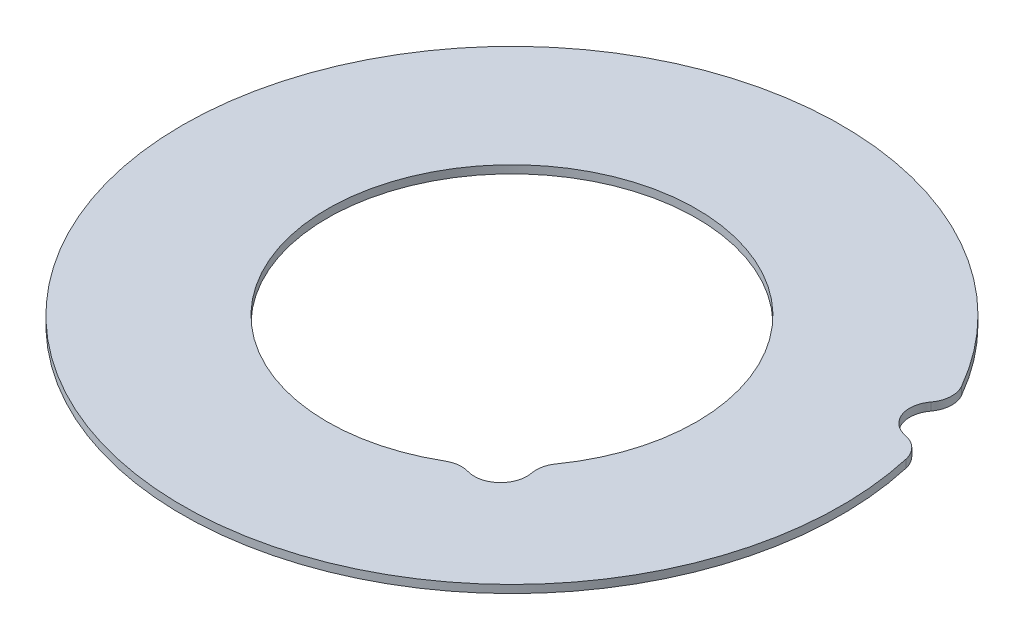
ISO-10303-21;
HEADER;
FILE_DESCRIPTION(('STEP AP214'),'2;1');
FILE_NAME('part.step','',(''),(''),'','','');
FILE_SCHEMA(('AUTOMOTIVE_DESIGN { 1 0 10303 214 1 1 1 1 }'));
ENDSEC;
DATA;
#1=APPLICATION_CONTEXT('core data for automotive mechanical design processes');
#2=APPLICATION_PROTOCOL_DEFINITION('international standard','automotive_design',2000,#1);
#3=PRODUCT_CONTEXT('',#1,'mechanical');
#4=PRODUCT('Part','Part','',(#3));
#5=PRODUCT_RELATED_PRODUCT_CATEGORY('part','',(#4));
#6=PRODUCT_DEFINITION_FORMATION('','',#4);
#7=PRODUCT_DEFINITION_CONTEXT('part definition',#1,'design');
#8=PRODUCT_DEFINITION('design','',#6,#7);
#9=PRODUCT_DEFINITION_SHAPE('','',#8);
#10=(LENGTH_UNIT() NAMED_UNIT(*) SI_UNIT(.MILLI.,.METRE.));
#11=(NAMED_UNIT(*) PLANE_ANGLE_UNIT() SI_UNIT($,.RADIAN.));
#12=(NAMED_UNIT(*) SI_UNIT($,.STERADIAN.) SOLID_ANGLE_UNIT());
#13=UNCERTAINTY_MEASURE_WITH_UNIT(LENGTH_MEASURE(1.E-05),#10,'distance_accuracy_value','');
#14=(GEOMETRIC_REPRESENTATION_CONTEXT(3) GLOBAL_UNCERTAINTY_ASSIGNED_CONTEXT((#13)) GLOBAL_UNIT_ASSIGNED_CONTEXT((#10,
#11,#12)) REPRESENTATION_CONTEXT('',''));
#15=CARTESIAN_POINT('',(0.,0.,0.));
#16=DIRECTION('',(0.,0.,1.));
#17=DIRECTION('',(1.,0.,0.));
#18=AXIS2_PLACEMENT_3D('',#15,#16,#17);
#19=CARTESIAN_POINT('',(-7.,0.,0.));
#20=DIRECTION('',(0.,1.,0.));
#21=DIRECTION('',(0.,0.,1.));
#22=AXIS2_PLACEMENT_3D('',#19,#20,#21);
#23=PLANE('',#22);
#24=CARTESIAN_POINT('',(4.5710736778126,0.,5.00000000005045));
#25=DIRECTION('',(0.,1.,0.));
#26=DIRECTION('',(0.,0.,1.));
#27=AXIS2_PLACEMENT_3D('',#24,#25,#26);
#28=CIRCLE('',#27,1.);
#29=CARTESIAN_POINT('',(4.29210611743141,0.,5.96030052606039));
#30=VERTEX_POINT('',#29);
#31=CARTESIAN_POINT('',(5.55247832229152,0.,4.80804968409548));
#32=VERTEX_POINT('',#31);
#33=EDGE_CURVE('E169',#30,#32,#28,.T.);
#34=ORIENTED_EDGE('',*,*,#33,.T.);
#35=CARTESIAN_POINT('',(6.53388296677043,0.,4.61609936814051));
#36=DIRECTION('',(0.,1.,0.));
#37=DIRECTION('',(0.,0.,1.));
#38=AXIS2_PLACEMENT_3D('',#35,#36,#37);
#39=CIRCLE('',#38,1.);
#40=CARTESIAN_POINT('',(5.71714759592413,0.,4.03908694712294));
#41=VERTEX_POINT('',#40);
#42=EDGE_CURVE('E144',#32,#41,#39,.F.);
#43=ORIENTED_EDGE('',*,*,#42,.T.);
#44=CARTESIAN_POINT('',(0.,0.,0.));
#45=DIRECTION('',(0.,-1.,0.));
#46=DIRECTION('',(0.,0.,-1.));
#47=AXIS2_PLACEMENT_3D('',#44,#45,#46);
#48=CIRCLE('',#47,7.);
#49=CARTESIAN_POINT('',(3.51149623741894,0.,6.05552592056154));
#50=VERTEX_POINT('',#49);
#51=EDGE_CURVE('E120',#50,#41,#48,.T.);
#52=ORIENTED_EDGE('',*,*,#51,.F.);
#53=CARTESIAN_POINT('',(4.01313855705022,0.,6.92060105207033));
#54=DIRECTION('',(0.,1.,0.));
#55=DIRECTION('',(0.,0.,1.));
#56=AXIS2_PLACEMENT_3D('',#53,#54,#55);
#57=CIRCLE('',#56,1.);
#58=EDGE_CURVE('E123',#50,#30,#57,.F.);
#59=ORIENTED_EDGE('',*,*,#58,.T.);
#60=EDGE_LOOP('',(#34,#43,#52,#59));
#61=FACE_BOUND('',#60,.T.);
#62=CARTESIAN_POINT('',(11.5891883068672,0.,-4.50000000009671));
#63=DIRECTION('',(0.,1.,0.));
#64=DIRECTION('',(0.,0.,1.));
#65=AXIS2_PLACEMENT_3D('',#62,#63,#64);
#66=CIRCLE('',#65,1.);
#67=CARTESIAN_POINT('',(10.7888489190033,0.,-5.09954721611355));
#68=VERTEX_POINT('',#67);
#69=CARTESIAN_POINT('',(11.4031642291589,0.,-3.51745481410639));
#70=VERTEX_POINT('',#69);
#71=EDGE_CURVE('E153',#68,#70,#66,.T.);
#72=ORIENTED_EDGE('',*,*,#71,.T.);
#73=CARTESIAN_POINT('',(11.2171401514506,0.,-2.53490962811606));
#74=DIRECTION('',(0.,1.,0.));
#75=DIRECTION('',(0.,0.,1.));
#76=AXIS2_PLACEMENT_3D('',#73,#74,#75);
#77=CIRCLE('',#76,1.);
#78=CARTESIAN_POINT('',(12.1925436428811,0.,-2.75533655230006));
#79=VERTEX_POINT('',#78);
#80=EDGE_CURVE('E141',#70,#79,#77,.F.);
#81=ORIENTED_EDGE('',*,*,#80,.T.);
#82=CARTESIAN_POINT('',(0.,0.,0.));
#83=DIRECTION('',(0.,-1.,0.));
#84=DIRECTION('',(0.,0.,-1.));
#85=AXIS2_PLACEMENT_3D('',#82,#83,#84);
#86=CIRCLE('',#85,12.5);
#87=CARTESIAN_POINT('',(10.8570755773253,0.,-6.19466786101128));
#88=VERTEX_POINT('',#87);
#89=EDGE_CURVE('E129',#79,#88,#86,.T.);
#90=ORIENTED_EDGE('',*,*,#89,.T.);
#91=CARTESIAN_POINT('',(9.98850953113929,0.,-5.69909443213038));
#92=DIRECTION('',(0.,1.,0.));
#93=DIRECTION('',(0.,0.,1.));
#94=AXIS2_PLACEMENT_3D('',#91,#92,#93);
#95=CIRCLE('',#94,1.);
#96=EDGE_CURVE('E53',#88,#68,#95,.F.);
#97=ORIENTED_EDGE('',*,*,#96,.T.);
#98=EDGE_LOOP('',(#72,#81,#90,#97));
#99=FACE_BOUND('',#98,.T.);
#100=ADVANCED_FACE('F33',(#61,#99),#23,.F.);
#101=CARTESIAN_POINT('',(0.,0.,0.));
#102=DIRECTION('',(0.,-1.,0.));
#103=DIRECTION('',(0.,0.,-1.));
#104=AXIS2_PLACEMENT_3D('',#101,#102,#103);
#105=CYLINDRICAL_SURFACE('',#104,12.5);
#106=ORIENTED_EDGE('',*,*,#89,.F.);
#107=DIRECTION('',(0.,-1.,0.));
#108=VECTOR('',#107,1.);
#109=CARTESIAN_POINT('',(12.1925436428811,0.,-2.75533655230006));
#110=LINE('',#109,#108);
#111=CARTESIAN_POINT('',(12.1925436428811,0.299999999999999,-2.75533655230006));
#112=VERTEX_POINT('',#111);
#113=EDGE_CURVE('E149',#79,#112,#110,.F.);
#114=ORIENTED_EDGE('',*,*,#113,.T.);
#115=CARTESIAN_POINT('',(0.,0.299999999999999,0.));
#116=DIRECTION('',(0.,-1.,0.));
#117=DIRECTION('',(0.,0.,-1.));
#118=AXIS2_PLACEMENT_3D('',#115,#116,#117);
#119=CIRCLE('',#118,12.5);
#120=CARTESIAN_POINT('',(10.8570755773253,0.299999999999999,-6.19466786101128));
#121=VERTEX_POINT('',#120);
#122=EDGE_CURVE('E119',#112,#121,#119,.T.);
#123=ORIENTED_EDGE('',*,*,#122,.T.);
#124=DIRECTION('',(0.,-1.,0.));
#125=VECTOR('',#124,1.);
#126=CARTESIAN_POINT('',(10.8570755773253,0.,-6.19466786101128));
#127=LINE('',#126,#125);
#128=EDGE_CURVE('E146',#121,#88,#127,.T.);
#129=ORIENTED_EDGE('',*,*,#128,.T.);
#130=EDGE_LOOP('',(#106,#114,#123,#129));
#131=FACE_BOUND('',#130,.T.);
#132=ADVANCED_FACE('F162',(#131),#105,.T.);
#133=CARTESIAN_POINT('',(-12.5,0.299999999999999,0.));
#134=DIRECTION('',(0.,-1.,0.));
#135=DIRECTION('',(0.,0.,-1.));
#136=AXIS2_PLACEMENT_3D('',#133,#134,#135);
#137=PLANE('',#136);
#138=ORIENTED_EDGE('',*,*,#122,.F.);
#139=CARTESIAN_POINT('',(11.2171401514506,0.3,-2.53490962811606));
#140=DIRECTION('',(0.,-1.,0.));
#141=DIRECTION('',(0.,0.,-1.));
#142=AXIS2_PLACEMENT_3D('',#139,#140,#141);
#143=CIRCLE('',#142,1.);
#144=CARTESIAN_POINT('',(11.4031642291589,0.3,-3.51745481410639));
#145=VERTEX_POINT('',#144);
#146=EDGE_CURVE('E108',#112,#145,#143,.F.);
#147=ORIENTED_EDGE('',*,*,#146,.T.);
#148=CARTESIAN_POINT('',(11.5891883068672,0.3,-4.50000000009671));
#149=DIRECTION('',(0.,-1.,0.));
#150=DIRECTION('',(0.,0.,-1.));
#151=AXIS2_PLACEMENT_3D('',#148,#149,#150);
#152=CIRCLE('',#151,1.);
#153=CARTESIAN_POINT('',(10.7888489190033,0.3,-5.09954721611355));
#154=VERTEX_POINT('',#153);
#155=EDGE_CURVE('E124',#145,#154,#152,.T.);
#156=ORIENTED_EDGE('',*,*,#155,.T.);
#157=CARTESIAN_POINT('',(9.98850953113929,0.3,-5.69909443213038));
#158=DIRECTION('',(0.,-1.,0.));
#159=DIRECTION('',(0.,0.,-1.));
#160=AXIS2_PLACEMENT_3D('',#157,#158,#159);
#161=CIRCLE('',#160,1.);
#162=EDGE_CURVE('E126',#154,#121,#161,.F.);
#163=ORIENTED_EDGE('',*,*,#162,.T.);
#164=EDGE_LOOP('',(#138,#147,#156,#163));
#165=FACE_BOUND('',#164,.T.);
#166=CARTESIAN_POINT('',(0.,0.299999999999999,0.));
#167=DIRECTION('',(0.,-1.,0.));
#168=DIRECTION('',(0.,0.,-1.));
#169=AXIS2_PLACEMENT_3D('',#166,#167,#168);
#170=CIRCLE('',#169,7.);
#171=CARTESIAN_POINT('',(3.51149623741894,0.299999999999999,6.05552592056154));
#172=VERTEX_POINT('',#171);
#173=CARTESIAN_POINT('',(5.71714759592413,0.299999999999999,4.03908694712294));
#174=VERTEX_POINT('',#173);
#175=EDGE_CURVE('E101',#172,#174,#170,.T.);
#176=ORIENTED_EDGE('',*,*,#175,.T.);
#177=CARTESIAN_POINT('',(6.53388296677043,0.3,4.61609936814051));
#178=DIRECTION('',(0.,-1.,0.));
#179=DIRECTION('',(0.,0.,-1.));
#180=AXIS2_PLACEMENT_3D('',#177,#178,#179);
#181=CIRCLE('',#180,1.);
#182=CARTESIAN_POINT('',(5.55247832229152,0.299999999999999,4.80804968409548));
#183=VERTEX_POINT('',#182);
#184=EDGE_CURVE('E107',#174,#183,#181,.F.);
#185=ORIENTED_EDGE('',*,*,#184,.T.);
#186=CARTESIAN_POINT('',(4.5710736778126,0.299999999999999,5.00000000005045));
#187=DIRECTION('',(0.,1.,0.));
#188=DIRECTION('',(0.,0.,1.));
#189=AXIS2_PLACEMENT_3D('',#186,#187,#188);
#190=CIRCLE('',#189,1.);
#191=CARTESIAN_POINT('',(4.29210611743141,0.299999999999999,5.96030052606039));
#192=VERTEX_POINT('',#191);
#193=EDGE_CURVE('E103',#192,#183,#190,.T.);
#194=ORIENTED_EDGE('',*,*,#193,.F.);
#195=CARTESIAN_POINT('',(4.01313855705022,0.3,6.92060105207033));
#196=DIRECTION('',(0.,-1.,0.));
#197=DIRECTION('',(0.,0.,-1.));
#198=AXIS2_PLACEMENT_3D('',#195,#196,#197);
#199=CIRCLE('',#198,1.);
#200=EDGE_CURVE('E98',#192,#172,#199,.F.);
#201=ORIENTED_EDGE('',*,*,#200,.T.);
#202=EDGE_LOOP('',(#176,#185,#194,#201));
#203=FACE_BOUND('',#202,.T.);
#204=ADVANCED_FACE('F100',(#165,#203),#137,.F.);
#205=CARTESIAN_POINT('',(0.,0.,0.));
#206=DIRECTION('',(0.,-1.,0.));
#207=DIRECTION('',(0.,0.,-1.));
#208=AXIS2_PLACEMENT_3D('',#205,#206,#207);
#209=CYLINDRICAL_SURFACE('',#208,7.);
#210=ORIENTED_EDGE('',*,*,#51,.T.);
#211=DIRECTION('',(0.,-1.,0.));
#212=VECTOR('',#211,1.);
#213=CARTESIAN_POINT('',(5.71714759592413,0.,4.03908694712294));
#214=LINE('',#213,#212);
#215=EDGE_CURVE('E118',#41,#174,#214,.F.);
#216=ORIENTED_EDGE('',*,*,#215,.T.);
#217=ORIENTED_EDGE('',*,*,#175,.F.);
#218=DIRECTION('',(0.,-1.,0.));
#219=VECTOR('',#218,1.);
#220=CARTESIAN_POINT('',(3.51149623741894,0.,6.05552592056154));
#221=LINE('',#220,#219);
#222=EDGE_CURVE('E115',#172,#50,#221,.T.);
#223=ORIENTED_EDGE('',*,*,#222,.T.);
#224=EDGE_LOOP('',(#210,#216,#217,#223));
#225=FACE_BOUND('',#224,.T.);
#226=ADVANCED_FACE('F114',(#225),#209,.F.);
#227=CARTESIAN_POINT('',(4.5710736778126,-9.7,5.00000000005045));
#228=DIRECTION('',(0.,1.,0.));
#229=DIRECTION('',(0.,0.,1.));
#230=AXIS2_PLACEMENT_3D('',#227,#228,#229);
#231=CYLINDRICAL_SURFACE('',#230,1.);
#232=ORIENTED_EDGE('',*,*,#193,.T.);
#233=DIRECTION('',(0.,1.,0.));
#234=VECTOR('',#233,1.);
#235=CARTESIAN_POINT('',(5.55247832229152,-9.7,4.80804968409548));
#236=LINE('',#235,#234);
#237=EDGE_CURVE('E138',#183,#32,#236,.F.);
#238=ORIENTED_EDGE('',*,*,#237,.T.);
#239=ORIENTED_EDGE('',*,*,#33,.F.);
#240=DIRECTION('',(0.,1.,0.));
#241=VECTOR('',#240,1.);
#242=CARTESIAN_POINT('',(4.29210611743141,-9.7,5.96030052606039));
#243=LINE('',#242,#241);
#244=EDGE_CURVE('E136',#30,#192,#243,.T.);
#245=ORIENTED_EDGE('',*,*,#244,.T.);
#246=EDGE_LOOP('',(#232,#238,#239,#245));
#247=FACE_BOUND('',#246,.T.);
#248=ADVANCED_FACE('F174',(#247),#231,.F.);
#249=CARTESIAN_POINT('',(11.5891883068672,-9.7,-4.50000000009671));
#250=DIRECTION('',(0.,1.,0.));
#251=DIRECTION('',(0.,0.,1.));
#252=AXIS2_PLACEMENT_3D('',#249,#250,#251);
#253=CYLINDRICAL_SURFACE('',#252,1.);
#254=ORIENTED_EDGE('',*,*,#155,.F.);
#255=DIRECTION('',(0.,1.,0.));
#256=VECTOR('',#255,1.);
#257=CARTESIAN_POINT('',(11.4031642291589,-9.7,-3.51745481410639));
#258=LINE('',#257,#256);
#259=EDGE_CURVE('E11',#145,#70,#258,.F.);
#260=ORIENTED_EDGE('',*,*,#259,.T.);
#261=ORIENTED_EDGE('',*,*,#71,.F.);
#262=DIRECTION('',(0.,1.,0.));
#263=VECTOR('',#262,1.);
#264=CARTESIAN_POINT('',(10.7888489190033,-9.7,-5.09954721611355));
#265=LINE('',#264,#263);
#266=EDGE_CURVE('E41',#68,#154,#265,.T.);
#267=ORIENTED_EDGE('',*,*,#266,.T.);
#268=EDGE_LOOP('',(#254,#260,#261,#267));
#269=FACE_BOUND('',#268,.T.);
#270=ADVANCED_FACE('F152',(#269),#253,.F.);
#271=CARTESIAN_POINT('',(6.53388296677043,-9.7,4.61609936814051));
#272=DIRECTION('',(0.,1.,0.));
#273=DIRECTION('',(0.,0.,1.));
#274=AXIS2_PLACEMENT_3D('',#271,#272,#273);
#275=CYLINDRICAL_SURFACE('',#274,1.);
#276=ORIENTED_EDGE('',*,*,#42,.F.);
#277=ORIENTED_EDGE('',*,*,#237,.F.);
#278=ORIENTED_EDGE('',*,*,#184,.F.);
#279=ORIENTED_EDGE('',*,*,#215,.F.);
#280=EDGE_LOOP('',(#276,#277,#278,#279));
#281=FACE_BOUND('',#280,.T.);
#282=ADVANCED_FACE('F178',(#281),#275,.T.);
#283=CARTESIAN_POINT('',(4.01313855705022,-9.7,6.92060105207033));
#284=DIRECTION('',(0.,-1.,0.));
#285=DIRECTION('',(0.,0.,-1.));
#286=AXIS2_PLACEMENT_3D('',#283,#284,#285);
#287=CYLINDRICAL_SURFACE('',#286,1.);
#288=ORIENTED_EDGE('',*,*,#200,.F.);
#289=ORIENTED_EDGE('',*,*,#244,.F.);
#290=ORIENTED_EDGE('',*,*,#58,.F.);
#291=ORIENTED_EDGE('',*,*,#222,.F.);
#292=EDGE_LOOP('',(#288,#289,#290,#291));
#293=FACE_BOUND('',#292,.T.);
#294=ADVANCED_FACE('F122',(#293),#287,.T.);
#295=CARTESIAN_POINT('',(11.2171401514506,-9.7,-2.53490962811606));
#296=DIRECTION('',(0.,-1.,0.));
#297=DIRECTION('',(0.,0.,-1.));
#298=AXIS2_PLACEMENT_3D('',#295,#296,#297);
#299=CYLINDRICAL_SURFACE('',#298,1.);
#300=ORIENTED_EDGE('',*,*,#80,.F.);
#301=ORIENTED_EDGE('',*,*,#259,.F.);
#302=ORIENTED_EDGE('',*,*,#146,.F.);
#303=ORIENTED_EDGE('',*,*,#113,.F.);
#304=EDGE_LOOP('',(#300,#301,#302,#303));
#305=FACE_BOUND('',#304,.T.);
#306=ADVANCED_FACE('F191',(#305),#299,.T.);
#307=CARTESIAN_POINT('',(9.98850953113929,-9.7,-5.69909443213038));
#308=DIRECTION('',(0.,1.,0.));
#309=DIRECTION('',(0.,0.,1.));
#310=AXIS2_PLACEMENT_3D('',#307,#308,#309);
#311=CYLINDRICAL_SURFACE('',#310,1.);
#312=ORIENTED_EDGE('',*,*,#162,.F.);
#313=ORIENTED_EDGE('',*,*,#266,.F.);
#314=ORIENTED_EDGE('',*,*,#96,.F.);
#315=ORIENTED_EDGE('',*,*,#128,.F.);
#316=EDGE_LOOP('',(#312,#313,#314,#315));
#317=FACE_BOUND('',#316,.T.);
#318=ADVANCED_FACE('F35',(#317),#311,.T.);
#319=CLOSED_SHELL('',(#100,#132,#204,#226,#248,#270,#282,#294,#306,#318));
#320=MANIFOLD_SOLID_BREP('B2',#319);
#321=ADVANCED_BREP_SHAPE_REPRESENTATION('',(#18,#320),#14);
#322=SHAPE_DEFINITION_REPRESENTATION(#9,#321);
ENDSEC;
END-ISO-10303-21;
